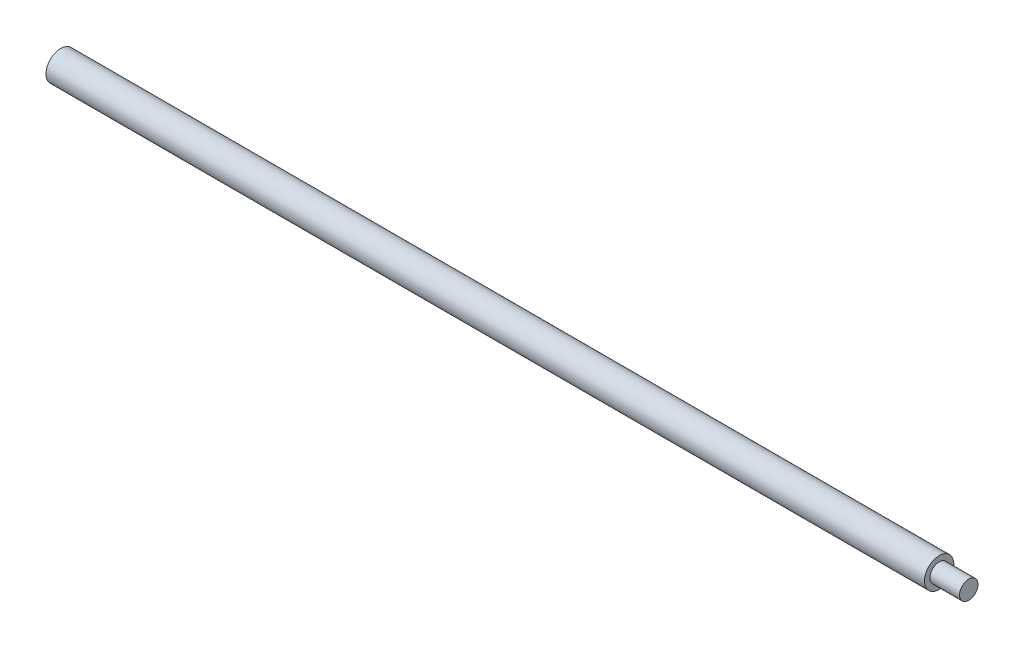
ISO-10303-21;
HEADER;
FILE_DESCRIPTION(('STEP AP214'),'2;1');
FILE_NAME('part.step','',(''),(''),'','','');
FILE_SCHEMA(('AUTOMOTIVE_DESIGN { 1 0 10303 214 1 1 1 1 }'));
ENDSEC;
DATA;
#1=APPLICATION_CONTEXT('core data for automotive mechanical design processes');
#2=APPLICATION_PROTOCOL_DEFINITION('international standard','automotive_design',2000,#1);
#3=PRODUCT_CONTEXT('',#1,'mechanical');
#4=PRODUCT('Part','Part','',(#3));
#5=PRODUCT_RELATED_PRODUCT_CATEGORY('part','',(#4));
#6=PRODUCT_DEFINITION_FORMATION('','',#4);
#7=PRODUCT_DEFINITION_CONTEXT('part definition',#1,'design');
#8=PRODUCT_DEFINITION('design','',#6,#7);
#9=PRODUCT_DEFINITION_SHAPE('','',#8);
#10=(LENGTH_UNIT() NAMED_UNIT(*) SI_UNIT(.MILLI.,.METRE.));
#11=(NAMED_UNIT(*) PLANE_ANGLE_UNIT() SI_UNIT($,.RADIAN.));
#12=(NAMED_UNIT(*) SI_UNIT($,.STERADIAN.) SOLID_ANGLE_UNIT());
#13=UNCERTAINTY_MEASURE_WITH_UNIT(LENGTH_MEASURE(1.E-05),#10,'distance_accuracy_value','');
#14=(GEOMETRIC_REPRESENTATION_CONTEXT(3) GLOBAL_UNCERTAINTY_ASSIGNED_CONTEXT((#13)) GLOBAL_UNIT_ASSIGNED_CONTEXT((#10,
#11,#12)) REPRESENTATION_CONTEXT('',''));
#15=CARTESIAN_POINT('',(0.,0.,0.));
#16=DIRECTION('',(0.,0.,1.));
#17=DIRECTION('',(1.,0.,0.));
#18=AXIS2_PLACEMENT_3D('',#15,#16,#17);
#19=CARTESIAN_POINT('',(95.,0.,0.));
#20=DIRECTION('',(-1.,0.,0.));
#21=DIRECTION('',(0.,0.,1.));
#22=AXIS2_PLACEMENT_3D('',#19,#20,#21);
#23=CYLINDRICAL_SURFACE('',#22,3.175);
#24=CARTESIAN_POINT('',(95.,0.,0.));
#25=DIRECTION('',(1.,0.,0.));
#26=DIRECTION('',(0.,0.,-1.));
#27=AXIS2_PLACEMENT_3D('',#24,#25,#26);
#28=CIRCLE('',#27,3.175);
#29=CARTESIAN_POINT('',(95.,0.,-3.175));
#30=VERTEX_POINT('',#29);
#31=EDGE_CURVE('E40',#30,#30,#28,.T.);
#32=ORIENTED_EDGE('',*,*,#31,.F.);
#33=EDGE_LOOP('',(#32));
#34=FACE_BOUND('',#33,.T.);
#35=CARTESIAN_POINT('',(-95.,0.,0.));
#36=DIRECTION('',(1.,0.,0.));
#37=DIRECTION('',(0.,0.,-1.));
#38=AXIS2_PLACEMENT_3D('',#35,#36,#37);
#39=CIRCLE('',#38,3.175);
#40=CARTESIAN_POINT('',(-95.,0.,-3.175));
#41=VERTEX_POINT('',#40);
#42=EDGE_CURVE('E36',#41,#41,#39,.T.);
#43=ORIENTED_EDGE('',*,*,#42,.T.);
#44=EDGE_LOOP('',(#43));
#45=FACE_BOUND('',#44,.T.);
#46=ADVANCED_FACE('F33',(#34,#45),#23,.T.);
#47=CARTESIAN_POINT('',(95.,0.,0.));
#48=DIRECTION('',(1.,0.,0.));
#49=DIRECTION('',(0.,0.,-1.));
#50=AXIS2_PLACEMENT_3D('',#47,#48,#49);
#51=PLANE('',#50);
#52=CARTESIAN_POINT('',(95.,0.,0.));
#53=DIRECTION('',(1.,0.,0.));
#54=DIRECTION('',(0.,0.,-1.));
#55=AXIS2_PLACEMENT_3D('',#52,#53,#54);
#56=CIRCLE('',#55,2.);
#57=CARTESIAN_POINT('',(95.,0.,-2.));
#58=VERTEX_POINT('',#57);
#59=EDGE_CURVE('E10',#58,#58,#56,.T.);
#60=ORIENTED_EDGE('',*,*,#59,.F.);
#61=EDGE_LOOP('',(#60));
#62=FACE_BOUND('',#61,.T.);
#63=ORIENTED_EDGE('',*,*,#31,.T.);
#64=EDGE_LOOP('',(#63));
#65=FACE_BOUND('',#64,.T.);
#66=ADVANCED_FACE('F57',(#62,#65),#51,.T.);
#67=CARTESIAN_POINT('',(-95.,0.,0.));
#68=DIRECTION('',(1.,0.,0.));
#69=DIRECTION('',(0.,0.,-1.));
#70=AXIS2_PLACEMENT_3D('',#67,#68,#69);
#71=PLANE('',#70);
#72=ORIENTED_EDGE('',*,*,#42,.F.);
#73=EDGE_LOOP('',(#72));
#74=FACE_BOUND('',#73,.T.);
#75=ADVANCED_FACE('F54',(#74),#71,.F.);
#76=CARTESIAN_POINT('',(101.4,0.,0.));
#77=DIRECTION('',(-1.,0.,0.));
#78=DIRECTION('',(0.,0.,1.));
#79=AXIS2_PLACEMENT_3D('',#76,#77,#78);
#80=CYLINDRICAL_SURFACE('',#79,2.);
#81=CARTESIAN_POINT('',(101.4,0.,0.));
#82=DIRECTION('',(1.,0.,0.));
#83=DIRECTION('',(0.,0.,-1.));
#84=AXIS2_PLACEMENT_3D('',#81,#82,#83);
#85=CIRCLE('',#84,2.);
#86=CARTESIAN_POINT('',(101.4,0.,-2.));
#87=VERTEX_POINT('',#86);
#88=EDGE_CURVE('E46',#87,#87,#85,.T.);
#89=ORIENTED_EDGE('',*,*,#88,.F.);
#90=EDGE_LOOP('',(#89));
#91=FACE_BOUND('',#90,.T.);
#92=ORIENTED_EDGE('',*,*,#59,.T.);
#93=EDGE_LOOP('',(#92));
#94=FACE_BOUND('',#93,.T.);
#95=ADVANCED_FACE('F56',(#91,#94),#80,.T.);
#96=CARTESIAN_POINT('',(101.4,0.,0.));
#97=DIRECTION('',(1.,0.,0.));
#98=DIRECTION('',(0.,0.,-1.));
#99=AXIS2_PLACEMENT_3D('',#96,#97,#98);
#100=PLANE('',#99);
#101=ORIENTED_EDGE('',*,*,#88,.T.);
#102=EDGE_LOOP('',(#101));
#103=FACE_BOUND('',#102,.T.);
#104=ADVANCED_FACE('F62',(#103),#100,.T.);
#105=CLOSED_SHELL('',(#46,#66,#75,#95,#104));
#106=MANIFOLD_SOLID_BREP('B2',#105);
#107=ADVANCED_BREP_SHAPE_REPRESENTATION('',(#18,#106),#14);
#108=SHAPE_DEFINITION_REPRESENTATION(#9,#107);
ENDSEC;
END-ISO-10303-21;
